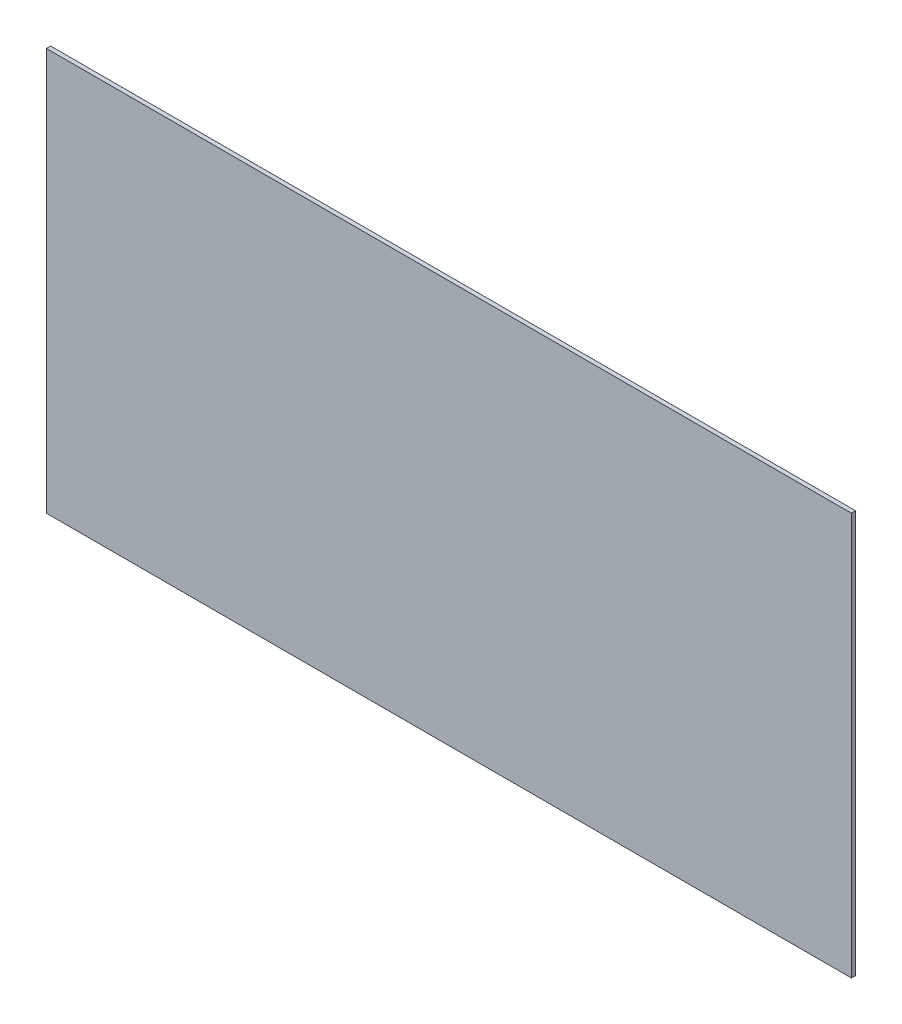
ISO-10303-21;
HEADER;
FILE_DESCRIPTION(('STEP AP214'),'2;1');
FILE_NAME('part.step','',(''),(''),'','','');
FILE_SCHEMA(('AUTOMOTIVE_DESIGN { 1 0 10303 214 1 1 1 1 }'));
ENDSEC;
DATA;
#1=APPLICATION_CONTEXT('core data for automotive mechanical design processes');
#2=APPLICATION_PROTOCOL_DEFINITION('international standard','automotive_design',2000,#1);
#3=PRODUCT_CONTEXT('',#1,'mechanical');
#4=PRODUCT('Part','Part','',(#3));
#5=PRODUCT_RELATED_PRODUCT_CATEGORY('part','',(#4));
#6=PRODUCT_DEFINITION_FORMATION('','',#4);
#7=PRODUCT_DEFINITION_CONTEXT('part definition',#1,'design');
#8=PRODUCT_DEFINITION('design','',#6,#7);
#9=PRODUCT_DEFINITION_SHAPE('','',#8);
#10=(LENGTH_UNIT() NAMED_UNIT(*) SI_UNIT(.MILLI.,.METRE.));
#11=(NAMED_UNIT(*) PLANE_ANGLE_UNIT() SI_UNIT($,.RADIAN.));
#12=(NAMED_UNIT(*) SI_UNIT($,.STERADIAN.) SOLID_ANGLE_UNIT());
#13=UNCERTAINTY_MEASURE_WITH_UNIT(LENGTH_MEASURE(1.E-05),#10,'distance_accuracy_value','');
#14=(GEOMETRIC_REPRESENTATION_CONTEXT(3) GLOBAL_UNCERTAINTY_ASSIGNED_CONTEXT((#13)) GLOBAL_UNIT_ASSIGNED_CONTEXT((#10,
#11,#12)) REPRESENTATION_CONTEXT('',''));
#15=CARTESIAN_POINT('',(0.,0.,0.));
#16=DIRECTION('',(0.,0.,1.));
#17=DIRECTION('',(1.,0.,0.));
#18=AXIS2_PLACEMENT_3D('',#15,#16,#17);
#19=CARTESIAN_POINT('',(-2438.4,1219.21,-0.01));
#20=DIRECTION('',(-1.,0.,0.));
#21=DIRECTION('',(0.,-1.,0.));
#22=AXIS2_PLACEMENT_3D('',#19,#20,#21);
#23=PLANE('',#22);
#24=DIRECTION('',(0.,-1.,0.));
#25=VECTOR('',#24,1.);
#26=CARTESIAN_POINT('',(-2438.4,0.,25.4));
#27=LINE('',#26,#25);
#28=CARTESIAN_POINT('',(-2438.4,1219.2,25.4));
#29=VERTEX_POINT('',#28);
#30=CARTESIAN_POINT('',(-2438.4,-1219.2,25.4));
#31=VERTEX_POINT('',#30);
#32=EDGE_CURVE('E69',#29,#31,#27,.T.);
#33=ORIENTED_EDGE('',*,*,#32,.F.);
#34=DIRECTION('',(0.,0.,1.));
#35=VECTOR('',#34,1.);
#36=CARTESIAN_POINT('',(-2438.4,1219.2,12.7));
#37=LINE('',#36,#35);
#38=CARTESIAN_POINT('',(-2438.4,1219.2,0.));
#39=VERTEX_POINT('',#38);
#40=EDGE_CURVE('E56',#39,#29,#37,.T.);
#41=ORIENTED_EDGE('',*,*,#40,.F.);
#42=DIRECTION('',(0.,1.,0.));
#43=VECTOR('',#42,1.);
#44=CARTESIAN_POINT('',(-2438.4,0.,0.));
#45=LINE('',#44,#43);
#46=CARTESIAN_POINT('',(-2438.4,-1219.2,0.));
#47=VERTEX_POINT('',#46);
#48=EDGE_CURVE('E21',#47,#39,#45,.T.);
#49=ORIENTED_EDGE('',*,*,#48,.F.);
#50=DIRECTION('',(0.,0.,-1.));
#51=VECTOR('',#50,1.);
#52=CARTESIAN_POINT('',(-2438.4,-1219.2,12.7));
#53=LINE('',#52,#51);
#54=EDGE_CURVE('E82',#31,#47,#53,.T.);
#55=ORIENTED_EDGE('',*,*,#54,.F.);
#56=EDGE_LOOP('',(#33,#41,#49,#55));
#57=FACE_BOUND('',#56,.T.);
#58=ADVANCED_FACE('F17',(#57),#23,.T.);
#59=CARTESIAN_POINT('',(2438.41,-1219.21,0.));
#60=DIRECTION('',(0.,0.,-1.));
#61=DIRECTION('',(-1.,0.,0.));
#62=AXIS2_PLACEMENT_3D('',#59,#60,#61);
#63=PLANE('',#62);
#64=DIRECTION('',(1.,0.,0.));
#65=VECTOR('',#64,1.);
#66=CARTESIAN_POINT('',(0.,-1219.2,0.));
#67=LINE('',#66,#65);
#68=CARTESIAN_POINT('',(2438.4,-1219.2,0.));
#69=VERTEX_POINT('',#68);
#70=EDGE_CURVE('E65',#47,#69,#67,.T.);
#71=ORIENTED_EDGE('',*,*,#70,.F.);
#72=ORIENTED_EDGE('',*,*,#48,.T.);
#73=DIRECTION('',(-1.,0.,0.));
#74=VECTOR('',#73,1.);
#75=CARTESIAN_POINT('',(0.,1219.2,0.));
#76=LINE('',#75,#74);
#77=CARTESIAN_POINT('',(2438.4,1219.2,0.));
#78=VERTEX_POINT('',#77);
#79=EDGE_CURVE('E62',#78,#39,#76,.T.);
#80=ORIENTED_EDGE('',*,*,#79,.F.);
#81=DIRECTION('',(0.,1.,0.));
#82=VECTOR('',#81,1.);
#83=CARTESIAN_POINT('',(2438.4,0.,0.));
#84=LINE('',#83,#82);
#85=EDGE_CURVE('E84',#69,#78,#84,.T.);
#86=ORIENTED_EDGE('',*,*,#85,.F.);
#87=EDGE_LOOP('',(#71,#72,#80,#86));
#88=FACE_BOUND('',#87,.T.);
#89=ADVANCED_FACE('F61',(#88),#63,.T.);
#90=CARTESIAN_POINT('',(2438.41,1219.2,-0.01));
#91=DIRECTION('',(0.,1.,0.));
#92=DIRECTION('',(-1.,0.,0.));
#93=AXIS2_PLACEMENT_3D('',#90,#91,#92);
#94=PLANE('',#93);
#95=DIRECTION('',(-1.,0.,0.));
#96=VECTOR('',#95,1.);
#97=CARTESIAN_POINT('',(0.,1219.2,25.4));
#98=LINE('',#97,#96);
#99=CARTESIAN_POINT('',(2438.4,1219.2,25.4));
#100=VERTEX_POINT('',#99);
#101=EDGE_CURVE('E71',#100,#29,#98,.T.);
#102=ORIENTED_EDGE('',*,*,#101,.F.);
#103=DIRECTION('',(0.,0.,1.));
#104=VECTOR('',#103,1.);
#105=CARTESIAN_POINT('',(2438.4,1219.2,12.7));
#106=LINE('',#105,#104);
#107=EDGE_CURVE('E75',#78,#100,#106,.T.);
#108=ORIENTED_EDGE('',*,*,#107,.F.);
#109=ORIENTED_EDGE('',*,*,#79,.T.);
#110=ORIENTED_EDGE('',*,*,#40,.T.);
#111=EDGE_LOOP('',(#102,#108,#109,#110));
#112=FACE_BOUND('',#111,.T.);
#113=ADVANCED_FACE('F73',(#112),#94,.T.);
#114=CARTESIAN_POINT('',(-2438.41,-1219.21,25.4));
#115=DIRECTION('',(0.,0.,1.));
#116=DIRECTION('',(1.,0.,0.));
#117=AXIS2_PLACEMENT_3D('',#114,#115,#116);
#118=PLANE('',#117);
#119=DIRECTION('',(-1.,0.,0.));
#120=VECTOR('',#119,1.);
#121=CARTESIAN_POINT('',(0.,-1219.2,25.4));
#122=LINE('',#121,#120);
#123=CARTESIAN_POINT('',(2438.4,-1219.2,25.4));
#124=VERTEX_POINT('',#123);
#125=EDGE_CURVE('E36',#124,#31,#122,.T.);
#126=ORIENTED_EDGE('',*,*,#125,.F.);
#127=DIRECTION('',(0.,-1.,0.));
#128=VECTOR('',#127,1.);
#129=CARTESIAN_POINT('',(2438.4,0.,25.4));
#130=LINE('',#129,#128);
#131=EDGE_CURVE('E27',#100,#124,#130,.T.);
#132=ORIENTED_EDGE('',*,*,#131,.F.);
#133=ORIENTED_EDGE('',*,*,#101,.T.);
#134=ORIENTED_EDGE('',*,*,#32,.T.);
#135=EDGE_LOOP('',(#126,#132,#133,#134));
#136=FACE_BOUND('',#135,.T.);
#137=ADVANCED_FACE('F89',(#136),#118,.T.);
#138=CARTESIAN_POINT('',(-2438.41,-1219.2,-0.01));
#139=DIRECTION('',(0.,-1.,0.));
#140=DIRECTION('',(1.,0.,0.));
#141=AXIS2_PLACEMENT_3D('',#138,#139,#140);
#142=PLANE('',#141);
#143=ORIENTED_EDGE('',*,*,#125,.T.);
#144=ORIENTED_EDGE('',*,*,#54,.T.);
#145=ORIENTED_EDGE('',*,*,#70,.T.);
#146=DIRECTION('',(0.,0.,-1.));
#147=VECTOR('',#146,1.);
#148=CARTESIAN_POINT('',(2438.4,-1219.2,12.7));
#149=LINE('',#148,#147);
#150=EDGE_CURVE('E11',#124,#69,#149,.T.);
#151=ORIENTED_EDGE('',*,*,#150,.F.);
#152=EDGE_LOOP('',(#143,#144,#145,#151));
#153=FACE_BOUND('',#152,.T.);
#154=ADVANCED_FACE('F91',(#153),#142,.T.);
#155=CARTESIAN_POINT('',(2438.4,-1219.21,-0.01));
#156=DIRECTION('',(1.,0.,0.));
#157=DIRECTION('',(0.,1.,0.));
#158=AXIS2_PLACEMENT_3D('',#155,#156,#157);
#159=PLANE('',#158);
#160=ORIENTED_EDGE('',*,*,#131,.T.);
#161=ORIENTED_EDGE('',*,*,#150,.T.);
#162=ORIENTED_EDGE('',*,*,#85,.T.);
#163=ORIENTED_EDGE('',*,*,#107,.T.);
#164=EDGE_LOOP('',(#160,#161,#162,#163));
#165=FACE_BOUND('',#164,.T.);
#166=ADVANCED_FACE('F19',(#165),#159,.T.);
#167=CLOSED_SHELL('',(#58,#89,#113,#137,#154,#166));
#168=MANIFOLD_SOLID_BREP('B1',#167);
#169=ADVANCED_BREP_SHAPE_REPRESENTATION('',(#18,#168),#14);
#170=SHAPE_DEFINITION_REPRESENTATION(#9,#169);
ENDSEC;
END-ISO-10303-21;
